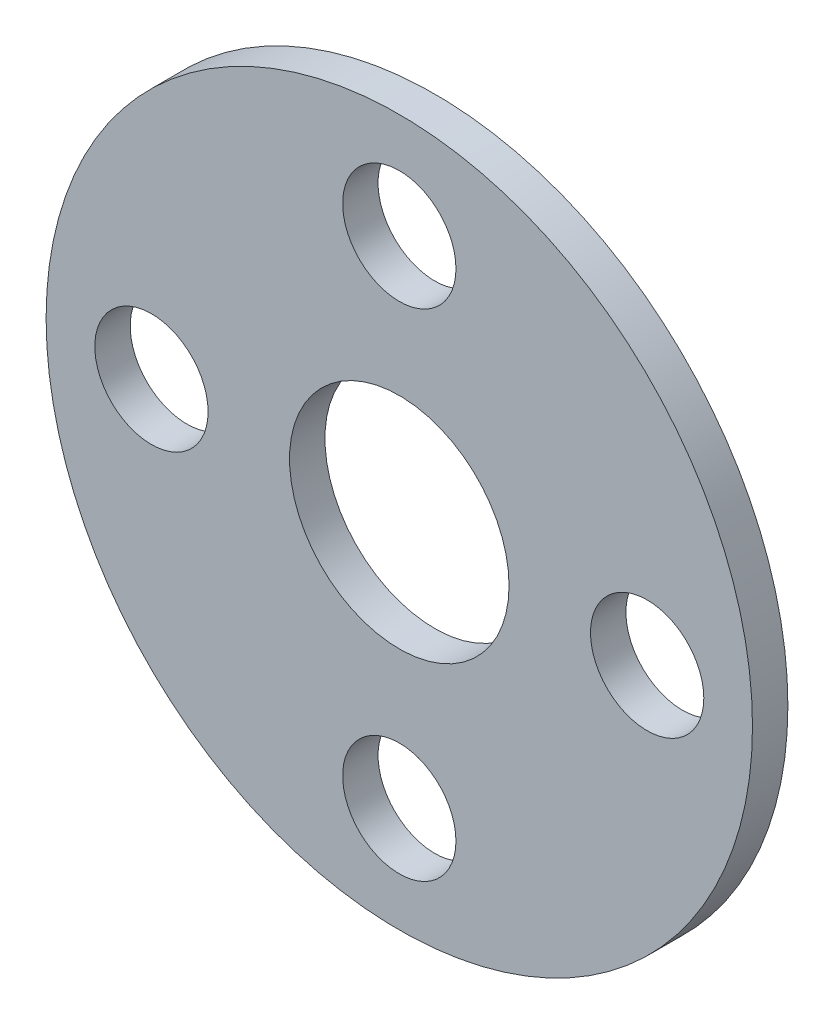
ISO-10303-21;
HEADER;
FILE_DESCRIPTION(('STEP AP214'),'2;1');
FILE_NAME('part.step','',(''),(''),'','','');
FILE_SCHEMA(('AUTOMOTIVE_DESIGN { 1 0 10303 214 1 1 1 1 }'));
ENDSEC;
DATA;
#1=APPLICATION_CONTEXT('core data for automotive mechanical design processes');
#2=APPLICATION_PROTOCOL_DEFINITION('international standard','automotive_design',2000,#1);
#3=PRODUCT_CONTEXT('',#1,'mechanical');
#4=PRODUCT('Part','Part','',(#3));
#5=PRODUCT_RELATED_PRODUCT_CATEGORY('part','',(#4));
#6=PRODUCT_DEFINITION_FORMATION('','',#4);
#7=PRODUCT_DEFINITION_CONTEXT('part definition',#1,'design');
#8=PRODUCT_DEFINITION('design','',#6,#7);
#9=PRODUCT_DEFINITION_SHAPE('','',#8);
#10=(LENGTH_UNIT() NAMED_UNIT(*) SI_UNIT(.MILLI.,.METRE.));
#11=(NAMED_UNIT(*) PLANE_ANGLE_UNIT() SI_UNIT($,.RADIAN.));
#12=(NAMED_UNIT(*) SI_UNIT($,.STERADIAN.) SOLID_ANGLE_UNIT());
#13=UNCERTAINTY_MEASURE_WITH_UNIT(LENGTH_MEASURE(1.E-05),#10,'distance_accuracy_value','');
#14=(GEOMETRIC_REPRESENTATION_CONTEXT(3) GLOBAL_UNCERTAINTY_ASSIGNED_CONTEXT((#13)) GLOBAL_UNIT_ASSIGNED_CONTEXT((#10,
#11,#12)) REPRESENTATION_CONTEXT('',''));
#15=CARTESIAN_POINT('',(0.,0.,0.));
#16=DIRECTION('',(0.,0.,1.));
#17=DIRECTION('',(1.,0.,0.));
#18=AXIS2_PLACEMENT_3D('',#15,#16,#17);
#19=CARTESIAN_POINT('',(0.,7.,0.));
#20=DIRECTION('',(0.,0.,1.));
#21=DIRECTION('',(1.,0.,0.));
#22=AXIS2_PLACEMENT_3D('',#19,#20,#21);
#23=CYLINDRICAL_SURFACE('',#22,1.6);
#24=CARTESIAN_POINT('',(0.,7.,1.));
#25=DIRECTION('',(0.,0.,1.));
#26=DIRECTION('',(1.,0.,0.));
#27=AXIS2_PLACEMENT_3D('',#24,#25,#26);
#28=CIRCLE('',#27,1.6);
#29=CARTESIAN_POINT('',(1.6,7.,1.));
#30=VERTEX_POINT('',#29);
#31=EDGE_CURVE('E42',#30,#30,#28,.T.);
#32=ORIENTED_EDGE('',*,*,#31,.T.);
#33=EDGE_LOOP('',(#32));
#34=FACE_BOUND('',#33,.T.);
#35=CARTESIAN_POINT('',(0.,7.,0.));
#36=DIRECTION('',(0.,0.,1.));
#37=DIRECTION('',(1.,0.,0.));
#38=AXIS2_PLACEMENT_3D('',#35,#36,#37);
#39=CIRCLE('',#38,1.6);
#40=CARTESIAN_POINT('',(1.6,7.,0.));
#41=VERTEX_POINT('',#40);
#42=EDGE_CURVE('E9',#41,#41,#39,.T.);
#43=ORIENTED_EDGE('',*,*,#42,.F.);
#44=EDGE_LOOP('',(#43));
#45=FACE_BOUND('',#44,.T.);
#46=ADVANCED_FACE('F14',(#34,#45),#23,.F.);
#47=CARTESIAN_POINT('',(7.,0.,0.));
#48=DIRECTION('',(0.,0.,1.));
#49=DIRECTION('',(1.,0.,0.));
#50=AXIS2_PLACEMENT_3D('',#47,#48,#49);
#51=CYLINDRICAL_SURFACE('',#50,1.6);
#52=CARTESIAN_POINT('',(7.,0.,1.));
#53=DIRECTION('',(0.,0.,1.));
#54=DIRECTION('',(1.,0.,0.));
#55=AXIS2_PLACEMENT_3D('',#52,#53,#54);
#56=CIRCLE('',#55,1.6);
#57=CARTESIAN_POINT('',(8.6,0.,1.));
#58=VERTEX_POINT('',#57);
#59=EDGE_CURVE('E40',#58,#58,#56,.T.);
#60=ORIENTED_EDGE('',*,*,#59,.T.);
#61=EDGE_LOOP('',(#60));
#62=FACE_BOUND('',#61,.T.);
#63=CARTESIAN_POINT('',(7.,0.,0.));
#64=DIRECTION('',(0.,0.,1.));
#65=DIRECTION('',(1.,0.,0.));
#66=AXIS2_PLACEMENT_3D('',#63,#64,#65);
#67=CIRCLE('',#66,1.6);
#68=CARTESIAN_POINT('',(8.6,0.,0.));
#69=VERTEX_POINT('',#68);
#70=EDGE_CURVE('E17',#69,#69,#67,.T.);
#71=ORIENTED_EDGE('',*,*,#70,.F.);
#72=EDGE_LOOP('',(#71));
#73=FACE_BOUND('',#72,.T.);
#74=ADVANCED_FACE('F80',(#62,#73),#51,.F.);
#75=CARTESIAN_POINT('',(0.,0.,0.));
#76=DIRECTION('',(0.,0.,1.));
#77=DIRECTION('',(1.,0.,0.));
#78=AXIS2_PLACEMENT_3D('',#75,#76,#77);
#79=CYLINDRICAL_SURFACE('',#78,3.1);
#80=CARTESIAN_POINT('',(0.,0.,1.));
#81=DIRECTION('',(0.,0.,1.));
#82=DIRECTION('',(1.,0.,0.));
#83=AXIS2_PLACEMENT_3D('',#80,#81,#82);
#84=CIRCLE('',#83,3.1);
#85=CARTESIAN_POINT('',(3.1,0.,1.));
#86=VERTEX_POINT('',#85);
#87=EDGE_CURVE('E36',#86,#86,#84,.T.);
#88=ORIENTED_EDGE('',*,*,#87,.T.);
#89=EDGE_LOOP('',(#88));
#90=FACE_BOUND('',#89,.T.);
#91=CARTESIAN_POINT('',(0.,0.,0.));
#92=DIRECTION('',(0.,0.,1.));
#93=DIRECTION('',(1.,0.,0.));
#94=AXIS2_PLACEMENT_3D('',#91,#92,#93);
#95=CIRCLE('',#94,3.1);
#96=CARTESIAN_POINT('',(3.1,0.,0.));
#97=VERTEX_POINT('',#96);
#98=EDGE_CURVE('E31',#97,#97,#95,.T.);
#99=ORIENTED_EDGE('',*,*,#98,.F.);
#100=EDGE_LOOP('',(#99));
#101=FACE_BOUND('',#100,.T.);
#102=ADVANCED_FACE('F120',(#90,#101),#79,.F.);
#103=CARTESIAN_POINT('',(-7.,0.,0.));
#104=DIRECTION('',(0.,0.,1.));
#105=DIRECTION('',(1.,0.,0.));
#106=AXIS2_PLACEMENT_3D('',#103,#104,#105);
#107=CYLINDRICAL_SURFACE('',#106,1.6);
#108=CARTESIAN_POINT('',(-7.,0.,1.));
#109=DIRECTION('',(0.,0.,1.));
#110=DIRECTION('',(1.,0.,0.));
#111=AXIS2_PLACEMENT_3D('',#108,#109,#110);
#112=CIRCLE('',#111,1.6);
#113=CARTESIAN_POINT('',(-5.4,0.,1.));
#114=VERTEX_POINT('',#113);
#115=EDGE_CURVE('E41',#114,#114,#112,.T.);
#116=ORIENTED_EDGE('',*,*,#115,.T.);
#117=EDGE_LOOP('',(#116));
#118=FACE_BOUND('',#117,.T.);
#119=CARTESIAN_POINT('',(-7.,0.,0.));
#120=DIRECTION('',(0.,0.,1.));
#121=DIRECTION('',(1.,0.,0.));
#122=AXIS2_PLACEMENT_3D('',#119,#120,#121);
#123=CIRCLE('',#122,1.6);
#124=CARTESIAN_POINT('',(-5.4,0.,0.));
#125=VERTEX_POINT('',#124);
#126=EDGE_CURVE('E49',#125,#125,#123,.T.);
#127=ORIENTED_EDGE('',*,*,#126,.F.);
#128=EDGE_LOOP('',(#127));
#129=FACE_BOUND('',#128,.T.);
#130=ADVANCED_FACE('F111',(#118,#129),#107,.F.);
#131=CARTESIAN_POINT('',(0.,-7.,0.));
#132=DIRECTION('',(0.,0.,1.));
#133=DIRECTION('',(1.,0.,0.));
#134=AXIS2_PLACEMENT_3D('',#131,#132,#133);
#135=CYLINDRICAL_SURFACE('',#134,1.6);
#136=CARTESIAN_POINT('',(0.,-7.,1.));
#137=DIRECTION('',(0.,0.,1.));
#138=DIRECTION('',(1.,0.,0.));
#139=AXIS2_PLACEMENT_3D('',#136,#137,#138);
#140=CIRCLE('',#139,1.6);
#141=CARTESIAN_POINT('',(1.6,-7.,1.));
#142=VERTEX_POINT('',#141);
#143=EDGE_CURVE('E34',#142,#142,#140,.T.);
#144=ORIENTED_EDGE('',*,*,#143,.T.);
#145=EDGE_LOOP('',(#144));
#146=FACE_BOUND('',#145,.T.);
#147=CARTESIAN_POINT('',(0.,-7.,0.));
#148=DIRECTION('',(0.,0.,1.));
#149=DIRECTION('',(1.,0.,0.));
#150=AXIS2_PLACEMENT_3D('',#147,#148,#149);
#151=CIRCLE('',#150,1.6);
#152=CARTESIAN_POINT('',(1.6,-7.,0.));
#153=VERTEX_POINT('',#152);
#154=EDGE_CURVE('E46',#153,#153,#151,.T.);
#155=ORIENTED_EDGE('',*,*,#154,.F.);
#156=EDGE_LOOP('',(#155));
#157=FACE_BOUND('',#156,.T.);
#158=ADVANCED_FACE('F105',(#146,#157),#135,.F.);
#159=CARTESIAN_POINT('',(0.,0.,0.));
#160=DIRECTION('',(0.,0.,1.));
#161=DIRECTION('',(1.,0.,0.));
#162=AXIS2_PLACEMENT_3D('',#159,#160,#161);
#163=PLANE('',#162);
#164=ORIENTED_EDGE('',*,*,#42,.T.);
#165=EDGE_LOOP('',(#164));
#166=FACE_BOUND('',#165,.T.);
#167=ORIENTED_EDGE('',*,*,#70,.T.);
#168=EDGE_LOOP('',(#167));
#169=FACE_BOUND('',#168,.T.);
#170=ORIENTED_EDGE('',*,*,#98,.T.);
#171=EDGE_LOOP('',(#170));
#172=FACE_BOUND('',#171,.T.);
#173=ORIENTED_EDGE('',*,*,#126,.T.);
#174=EDGE_LOOP('',(#173));
#175=FACE_BOUND('',#174,.T.);
#176=ORIENTED_EDGE('',*,*,#154,.T.);
#177=EDGE_LOOP('',(#176));
#178=FACE_BOUND('',#177,.T.);
#179=CARTESIAN_POINT('',(0.,0.,0.));
#180=DIRECTION('',(0.,0.,1.));
#181=DIRECTION('',(1.,0.,0.));
#182=AXIS2_PLACEMENT_3D('',#179,#180,#181);
#183=CIRCLE('',#182,9.975);
#184=CARTESIAN_POINT('',(9.975,0.,0.));
#185=VERTEX_POINT('',#184);
#186=EDGE_CURVE('E63',#185,#185,#183,.T.);
#187=ORIENTED_EDGE('',*,*,#186,.F.);
#188=EDGE_LOOP('',(#187));
#189=FACE_BOUND('',#188,.T.);
#190=ADVANCED_FACE('F87',(#166,#169,#172,#175,#178,#189),#163,.F.);
#191=CARTESIAN_POINT('',(0.,0.,1.));
#192=DIRECTION('',(0.,0.,1.));
#193=DIRECTION('',(1.,0.,0.));
#194=AXIS2_PLACEMENT_3D('',#191,#192,#193);
#195=PLANE('',#194);
#196=ORIENTED_EDGE('',*,*,#31,.F.);
#197=EDGE_LOOP('',(#196));
#198=FACE_BOUND('',#197,.T.);
#199=ORIENTED_EDGE('',*,*,#59,.F.);
#200=EDGE_LOOP('',(#199));
#201=FACE_BOUND('',#200,.T.);
#202=ORIENTED_EDGE('',*,*,#87,.F.);
#203=EDGE_LOOP('',(#202));
#204=FACE_BOUND('',#203,.T.);
#205=ORIENTED_EDGE('',*,*,#115,.F.);
#206=EDGE_LOOP('',(#205));
#207=FACE_BOUND('',#206,.T.);
#208=ORIENTED_EDGE('',*,*,#143,.F.);
#209=EDGE_LOOP('',(#208));
#210=FACE_BOUND('',#209,.T.);
#211=CARTESIAN_POINT('',(0.,0.,1.));
#212=DIRECTION('',(0.,0.,1.));
#213=DIRECTION('',(1.,0.,0.));
#214=AXIS2_PLACEMENT_3D('',#211,#212,#213);
#215=CIRCLE('',#214,9.975);
#216=CARTESIAN_POINT('',(9.975,0.,1.));
#217=VERTEX_POINT('',#216);
#218=EDGE_CURVE('E67',#217,#217,#215,.T.);
#219=ORIENTED_EDGE('',*,*,#218,.T.);
#220=EDGE_LOOP('',(#219));
#221=FACE_BOUND('',#220,.T.);
#222=ADVANCED_FACE('F83',(#198,#201,#204,#207,#210,#221),#195,.T.);
#223=CARTESIAN_POINT('',(0.,0.,0.));
#224=DIRECTION('',(0.,0.,1.));
#225=DIRECTION('',(1.,0.,0.));
#226=AXIS2_PLACEMENT_3D('',#223,#224,#225);
#227=CYLINDRICAL_SURFACE('',#226,9.975);
#228=ORIENTED_EDGE('',*,*,#218,.F.);
#229=EDGE_LOOP('',(#228));
#230=FACE_BOUND('',#229,.T.);
#231=ORIENTED_EDGE('',*,*,#186,.T.);
#232=EDGE_LOOP('',(#231));
#233=FACE_BOUND('',#232,.T.);
#234=ADVANCED_FACE('F86',(#230,#233),#227,.T.);
#235=CLOSED_SHELL('',(#46,#74,#102,#130,#158,#190,#222,#234));
#236=MANIFOLD_SOLID_BREP('B1',#235);
#237=ADVANCED_BREP_SHAPE_REPRESENTATION('',(#18,#236),#14);
#238=SHAPE_DEFINITION_REPRESENTATION(#9,#237);
ENDSEC;
END-ISO-10303-21;
